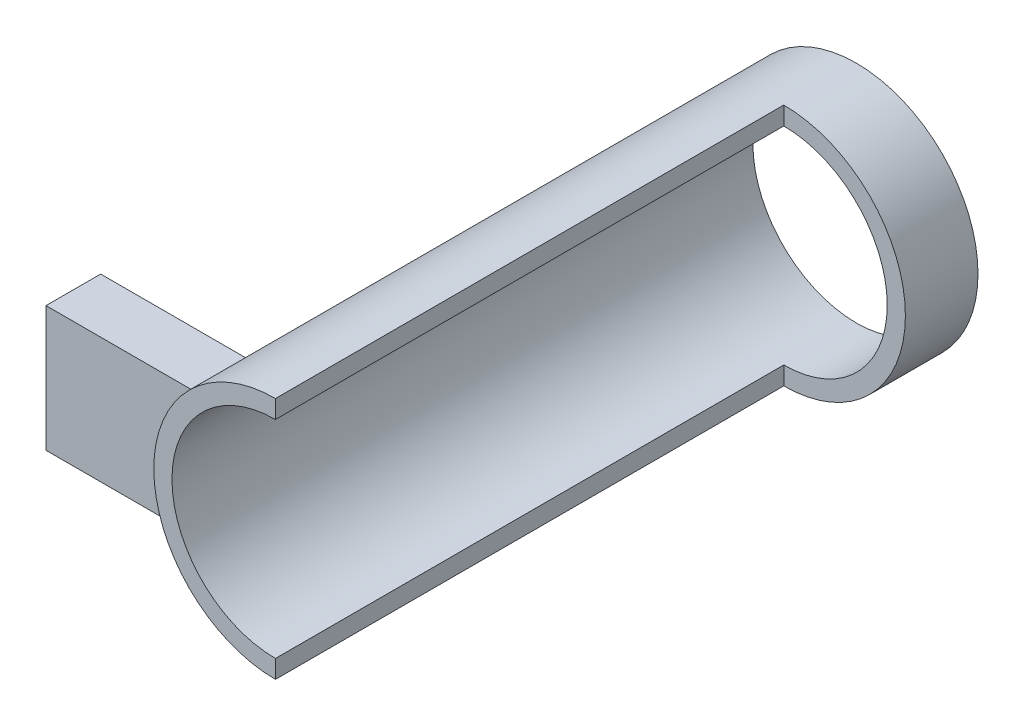
ISO-10303-21;
HEADER;
FILE_DESCRIPTION(('STEP AP214'),'2;1');
FILE_NAME('part.step','',(''),(''),'','','');
FILE_SCHEMA(('AUTOMOTIVE_DESIGN { 1 0 10303 214 1 1 1 1 }'));
ENDSEC;
DATA;
#1=APPLICATION_CONTEXT('core data for automotive mechanical design processes');
#2=APPLICATION_PROTOCOL_DEFINITION('international standard','automotive_design',2000,#1);
#3=PRODUCT_CONTEXT('',#1,'mechanical');
#4=PRODUCT('Part','Part','',(#3));
#5=PRODUCT_RELATED_PRODUCT_CATEGORY('part','',(#4));
#6=PRODUCT_DEFINITION_FORMATION('','',#4);
#7=PRODUCT_DEFINITION_CONTEXT('part definition',#1,'design');
#8=PRODUCT_DEFINITION('design','',#6,#7);
#9=PRODUCT_DEFINITION_SHAPE('','',#8);
#10=(LENGTH_UNIT() NAMED_UNIT(*) SI_UNIT(.MILLI.,.METRE.));
#11=(NAMED_UNIT(*) PLANE_ANGLE_UNIT() SI_UNIT($,.RADIAN.));
#12=(NAMED_UNIT(*) SI_UNIT($,.STERADIAN.) SOLID_ANGLE_UNIT());
#13=UNCERTAINTY_MEASURE_WITH_UNIT(LENGTH_MEASURE(1.E-05),#10,'distance_accuracy_value','');
#14=(GEOMETRIC_REPRESENTATION_CONTEXT(3) GLOBAL_UNCERTAINTY_ASSIGNED_CONTEXT((#13)) GLOBAL_UNIT_ASSIGNED_CONTEXT((#10,
#11,#12)) REPRESENTATION_CONTEXT('',''));
#15=CARTESIAN_POINT('',(0.,0.,0.));
#16=DIRECTION('',(0.,0.,1.));
#17=DIRECTION('',(1.,0.,0.));
#18=AXIS2_PLACEMENT_3D('',#15,#16,#17);
#19=CARTESIAN_POINT('',(0.,0.,2.));
#20=DIRECTION('',(0.,0.,1.));
#21=DIRECTION('',(1.,0.,0.));
#22=AXIS2_PLACEMENT_3D('',#19,#20,#21);
#23=PLANE('',#22);
#24=DIRECTION('',(0.,1.,0.));
#25=VECTOR('',#24,1.);
#26=CARTESIAN_POINT('',(0.,3.35,2.));
#27=LINE('',#26,#25);
#28=CARTESIAN_POINT('',(0.,2.85,2.));
#29=VERTEX_POINT('',#28);
#30=CARTESIAN_POINT('',(0.,3.35,2.));
#31=VERTEX_POINT('',#30);
#32=EDGE_CURVE('E144',#29,#31,#27,.T.);
#33=ORIENTED_EDGE('',*,*,#32,.F.);
#34=CARTESIAN_POINT('',(0.,0.,2.));
#35=DIRECTION('',(0.,0.,1.));
#36=DIRECTION('',(1.,0.,0.));
#37=AXIS2_PLACEMENT_3D('',#34,#35,#36);
#38=CIRCLE('',#37,2.85);
#39=CARTESIAN_POINT('',(0.,-2.85,2.));
#40=VERTEX_POINT('',#39);
#41=EDGE_CURVE('E163',#40,#29,#38,.T.);
#42=ORIENTED_EDGE('',*,*,#41,.F.);
#43=DIRECTION('',(0.,1.,0.));
#44=VECTOR('',#43,1.);
#45=CARTESIAN_POINT('',(0.,-2.85,2.));
#46=LINE('',#45,#44);
#47=CARTESIAN_POINT('',(0.,-3.35,2.));
#48=VERTEX_POINT('',#47);
#49=EDGE_CURVE('E139',#48,#40,#46,.T.);
#50=ORIENTED_EDGE('',*,*,#49,.F.);
#51=CARTESIAN_POINT('',(0.,0.,2.));
#52=DIRECTION('',(0.,0.,1.));
#53=DIRECTION('',(1.,0.,0.));
#54=AXIS2_PLACEMENT_3D('',#51,#52,#53);
#55=CIRCLE('',#54,3.35);
#56=EDGE_CURVE('E11',#48,#31,#55,.T.);
#57=ORIENTED_EDGE('',*,*,#56,.T.);
#58=EDGE_LOOP('',(#33,#42,#50,#57));
#59=FACE_BOUND('',#58,.T.);
#60=ADVANCED_FACE('F33',(#59),#23,.T.);
#61=CARTESIAN_POINT('',(0.,0.,0.));
#62=DIRECTION('',(0.,0.,1.));
#63=DIRECTION('',(1.,0.,0.));
#64=AXIS2_PLACEMENT_3D('',#61,#62,#63);
#65=PLANE('',#64);
#66=CARTESIAN_POINT('',(0.,0.,0.));
#67=DIRECTION('',(0.,0.,1.));
#68=DIRECTION('',(1.,0.,0.));
#69=AXIS2_PLACEMENT_3D('',#66,#67,#68);
#70=CIRCLE('',#69,3.35);
#71=CARTESIAN_POINT('',(3.35,0.,0.));
#72=VERTEX_POINT('',#71);
#73=EDGE_CURVE('E37',#72,#72,#70,.T.);
#74=ORIENTED_EDGE('',*,*,#73,.F.);
#75=EDGE_LOOP('',(#74));
#76=FACE_BOUND('',#75,.T.);
#77=CARTESIAN_POINT('',(0.,0.,0.));
#78=DIRECTION('',(0.,0.,1.));
#79=DIRECTION('',(1.,0.,0.));
#80=AXIS2_PLACEMENT_3D('',#77,#78,#79);
#81=CIRCLE('',#80,2.85);
#82=CARTESIAN_POINT('',(2.85,0.,0.));
#83=VERTEX_POINT('',#82);
#84=EDGE_CURVE('E162',#83,#83,#81,.T.);
#85=ORIENTED_EDGE('',*,*,#84,.T.);
#86=EDGE_LOOP('',(#85));
#87=FACE_BOUND('',#86,.T.);
#88=ADVANCED_FACE('F169',(#76,#87),#65,.F.);
#89=CARTESIAN_POINT('',(0.,0.,2.));
#90=DIRECTION('',(0.,0.,-1.));
#91=DIRECTION('',(-1.,0.,0.));
#92=AXIS2_PLACEMENT_3D('',#89,#90,#91);
#93=CYLINDRICAL_SURFACE('',#92,3.35);
#94=DIRECTION('',(0.,0.,-1.));
#95=VECTOR('',#94,1.);
#96=CARTESIAN_POINT('',(-2.8711163319531,-1.72603331613043,2.));
#97=LINE('',#96,#95);
#98=CARTESIAN_POINT('',(-2.8711163319531,-1.72603331613043,15.3194194759215));
#99=VERTEX_POINT('',#98);
#100=CARTESIAN_POINT('',(-2.8711163319531,-1.72603331613043,13.8140069595972));
#101=VERTEX_POINT('',#100);
#102=EDGE_CURVE('E134',#99,#101,#97,.T.);
#103=ORIENTED_EDGE('',*,*,#102,.T.);
#104=CARTESIAN_POINT('',(0.,0.,13.8140069595972));
#105=DIRECTION('',(0.,0.,-1.));
#106=DIRECTION('',(-1.,0.,0.));
#107=AXIS2_PLACEMENT_3D('',#104,#105,#106);
#108=CIRCLE('',#107,3.35);
#109=CARTESIAN_POINT('',(-2.8711163319531,1.72603331613043,13.8140069595972));
#110=VERTEX_POINT('',#109);
#111=EDGE_CURVE('E137',#101,#110,#108,.T.);
#112=ORIENTED_EDGE('',*,*,#111,.T.);
#113=DIRECTION('',(0.,0.,-1.));
#114=VECTOR('',#113,1.);
#115=CARTESIAN_POINT('',(-2.8711163319531,1.72603331613043,2.));
#116=LINE('',#115,#114);
#117=CARTESIAN_POINT('',(-2.8711163319531,1.72603331613043,15.3194194759215));
#118=VERTEX_POINT('',#117);
#119=EDGE_CURVE('E102',#110,#118,#116,.F.);
#120=ORIENTED_EDGE('',*,*,#119,.T.);
#121=CARTESIAN_POINT('',(0.,0.,15.3194194759215));
#122=DIRECTION('',(0.,0.,1.));
#123=DIRECTION('',(1.,0.,0.));
#124=AXIS2_PLACEMENT_3D('',#121,#122,#123);
#125=CIRCLE('',#124,3.35);
#126=EDGE_CURVE('E131',#118,#99,#125,.T.);
#127=ORIENTED_EDGE('',*,*,#126,.T.);
#128=EDGE_LOOP('',(#103,#112,#120,#127));
#129=FACE_BOUND('',#128,.T.);
#130=ORIENTED_EDGE('',*,*,#56,.F.);
#131=DIRECTION('',(0.,0.,-1.));
#132=VECTOR('',#131,1.);
#133=CARTESIAN_POINT('',(0.,-3.35,16.));
#134=LINE('',#133,#132);
#135=CARTESIAN_POINT('',(0.,-3.35,16.));
#136=VERTEX_POINT('',#135);
#137=EDGE_CURVE('E159',#136,#48,#134,.T.);
#138=ORIENTED_EDGE('',*,*,#137,.F.);
#139=CARTESIAN_POINT('',(0.,0.,16.));
#140=DIRECTION('',(0.,0.,1.));
#141=DIRECTION('',(1.,0.,0.));
#142=AXIS2_PLACEMENT_3D('',#139,#140,#141);
#143=CIRCLE('',#142,3.35);
#144=CARTESIAN_POINT('',(0.,3.35,16.));
#145=VERTEX_POINT('',#144);
#146=EDGE_CURVE('E140',#145,#136,#143,.T.);
#147=ORIENTED_EDGE('',*,*,#146,.F.);
#148=DIRECTION('',(0.,0.,-1.));
#149=VECTOR('',#148,1.);
#150=CARTESIAN_POINT('',(0.,3.35,16.));
#151=LINE('',#150,#149);
#152=EDGE_CURVE('E150',#145,#31,#151,.T.);
#153=ORIENTED_EDGE('',*,*,#152,.T.);
#154=EDGE_LOOP('',(#130,#138,#147,#153));
#155=FACE_BOUND('',#154,.T.);
#156=ORIENTED_EDGE('',*,*,#73,.T.);
#157=EDGE_LOOP('',(#156));
#158=FACE_BOUND('',#157,.T.);
#159=ADVANCED_FACE('F35',(#129,#155,#158),#93,.T.);
#160=CARTESIAN_POINT('',(0.,0.,2.));
#161=DIRECTION('',(0.,0.,-1.));
#162=DIRECTION('',(-1.,0.,0.));
#163=AXIS2_PLACEMENT_3D('',#160,#161,#162);
#164=CYLINDRICAL_SURFACE('',#163,2.85);
#165=DIRECTION('',(0.,0.,-1.));
#166=VECTOR('',#165,1.);
#167=CARTESIAN_POINT('',(0.,-2.85,16.));
#168=LINE('',#167,#166);
#169=CARTESIAN_POINT('',(0.,-2.85,16.));
#170=VERTEX_POINT('',#169);
#171=EDGE_CURVE('E157',#170,#40,#168,.T.);
#172=ORIENTED_EDGE('',*,*,#171,.T.);
#173=ORIENTED_EDGE('',*,*,#41,.T.);
#174=DIRECTION('',(0.,0.,-1.));
#175=VECTOR('',#174,1.);
#176=CARTESIAN_POINT('',(0.,2.85,16.));
#177=LINE('',#176,#175);
#178=CARTESIAN_POINT('',(0.,2.85,16.));
#179=VERTEX_POINT('',#178);
#180=EDGE_CURVE('E56',#179,#29,#177,.T.);
#181=ORIENTED_EDGE('',*,*,#180,.F.);
#182=CARTESIAN_POINT('',(0.,0.,16.));
#183=DIRECTION('',(0.,0.,-1.));
#184=DIRECTION('',(1.,0.,0.));
#185=AXIS2_PLACEMENT_3D('',#182,#183,#184);
#186=CIRCLE('',#185,2.85);
#187=EDGE_CURVE('E146',#170,#179,#186,.T.);
#188=ORIENTED_EDGE('',*,*,#187,.F.);
#189=EDGE_LOOP('',(#172,#173,#181,#188));
#190=FACE_BOUND('',#189,.T.);
#191=ORIENTED_EDGE('',*,*,#84,.F.);
#192=EDGE_LOOP('',(#191));
#193=FACE_BOUND('',#192,.T.);
#194=ADVANCED_FACE('F171',(#190,#193),#164,.F.);
#195=CARTESIAN_POINT('',(0.,-2.85,16.));
#196=DIRECTION('',(-1.,0.,0.));
#197=DIRECTION('',(0.,0.,1.));
#198=AXIS2_PLACEMENT_3D('',#195,#196,#197);
#199=PLANE('',#198);
#200=ORIENTED_EDGE('',*,*,#49,.T.);
#201=ORIENTED_EDGE('',*,*,#171,.F.);
#202=DIRECTION('',(0.,1.,0.));
#203=VECTOR('',#202,1.);
#204=CARTESIAN_POINT('',(0.,-2.85,16.));
#205=LINE('',#204,#203);
#206=EDGE_CURVE('E143',#136,#170,#205,.T.);
#207=ORIENTED_EDGE('',*,*,#206,.F.);
#208=ORIENTED_EDGE('',*,*,#137,.T.);
#209=EDGE_LOOP('',(#200,#201,#207,#208));
#210=FACE_BOUND('',#209,.T.);
#211=ADVANCED_FACE('F173',(#210),#199,.F.);
#212=CARTESIAN_POINT('',(0.,3.35,16.));
#213=DIRECTION('',(-1.,0.,0.));
#214=DIRECTION('',(0.,0.,1.));
#215=AXIS2_PLACEMENT_3D('',#212,#213,#214);
#216=PLANE('',#215);
#217=ORIENTED_EDGE('',*,*,#32,.T.);
#218=ORIENTED_EDGE('',*,*,#152,.F.);
#219=DIRECTION('',(0.,1.,0.));
#220=VECTOR('',#219,1.);
#221=CARTESIAN_POINT('',(0.,3.35,16.));
#222=LINE('',#221,#220);
#223=EDGE_CURVE('E148',#179,#145,#222,.T.);
#224=ORIENTED_EDGE('',*,*,#223,.F.);
#225=ORIENTED_EDGE('',*,*,#180,.T.);
#226=EDGE_LOOP('',(#217,#218,#224,#225));
#227=FACE_BOUND('',#226,.T.);
#228=ADVANCED_FACE('F180',(#227),#216,.F.);
#229=CARTESIAN_POINT('',(0.,0.,16.));
#230=DIRECTION('',(0.,0.,1.));
#231=DIRECTION('',(1.,0.,0.));
#232=AXIS2_PLACEMENT_3D('',#229,#230,#231);
#233=PLANE('',#232);
#234=ORIENTED_EDGE('',*,*,#146,.T.);
#235=ORIENTED_EDGE('',*,*,#206,.T.);
#236=ORIENTED_EDGE('',*,*,#187,.T.);
#237=ORIENTED_EDGE('',*,*,#223,.T.);
#238=EDGE_LOOP('',(#234,#235,#236,#237));
#239=FACE_BOUND('',#238,.T.);
#240=ADVANCED_FACE('F201',(#239),#233,.T.);
#241=CARTESIAN_POINT('',(-7.,-1.72603331613043,15.3194194759215));
#242=DIRECTION('',(0.,-1.,0.));
#243=DIRECTION('',(0.,0.,-1.));
#244=AXIS2_PLACEMENT_3D('',#241,#242,#243);
#245=PLANE('',#244);
#246=ORIENTED_EDGE('',*,*,#102,.F.);
#247=DIRECTION('',(1.,0.,0.));
#248=VECTOR('',#247,1.);
#249=CARTESIAN_POINT('',(-7.,-1.72603331613043,15.3194194759215));
#250=LINE('',#249,#248);
#251=CARTESIAN_POINT('',(-7.,-1.72603331613043,15.3194194759215));
#252=VERTEX_POINT('',#251);
#253=EDGE_CURVE('E126',#252,#99,#250,.T.);
#254=ORIENTED_EDGE('',*,*,#253,.F.);
#255=DIRECTION('',(0.,0.,-1.));
#256=VECTOR('',#255,1.);
#257=CARTESIAN_POINT('',(-7.,-1.72603331613043,15.3194194759215));
#258=LINE('',#257,#256);
#259=CARTESIAN_POINT('',(-7.,-1.72603331613043,13.8140069595972));
#260=VERTEX_POINT('',#259);
#261=EDGE_CURVE('E106',#252,#260,#258,.T.);
#262=ORIENTED_EDGE('',*,*,#261,.T.);
#263=DIRECTION('',(1.,0.,0.));
#264=VECTOR('',#263,1.);
#265=CARTESIAN_POINT('',(-7.,-1.72603331613043,13.8140069595972));
#266=LINE('',#265,#264);
#267=EDGE_CURVE('E120',#260,#101,#266,.T.);
#268=ORIENTED_EDGE('',*,*,#267,.T.);
#269=EDGE_LOOP('',(#246,#254,#262,#268));
#270=FACE_BOUND('',#269,.T.);
#271=ADVANCED_FACE('F203',(#270),#245,.T.);
#272=CARTESIAN_POINT('',(-7.,1.72603331613043,15.3194194759215));
#273=DIRECTION('',(0.,1.,0.));
#274=DIRECTION('',(0.,0.,1.));
#275=AXIS2_PLACEMENT_3D('',#272,#273,#274);
#276=PLANE('',#275);
#277=ORIENTED_EDGE('',*,*,#119,.F.);
#278=DIRECTION('',(1.,0.,0.));
#279=VECTOR('',#278,1.);
#280=CARTESIAN_POINT('',(-7.,1.72603331613043,13.8140069595972));
#281=LINE('',#280,#279);
#282=CARTESIAN_POINT('',(-7.,1.72603331613043,13.8140069595972));
#283=VERTEX_POINT('',#282);
#284=EDGE_CURVE('E97',#283,#110,#281,.T.);
#285=ORIENTED_EDGE('',*,*,#284,.F.);
#286=DIRECTION('',(0.,0.,1.));
#287=VECTOR('',#286,1.);
#288=CARTESIAN_POINT('',(-7.,1.72603331613043,15.3194194759215));
#289=LINE('',#288,#287);
#290=CARTESIAN_POINT('',(-7.,1.72603331613043,15.3194194759215));
#291=VERTEX_POINT('',#290);
#292=EDGE_CURVE('E100',#283,#291,#289,.T.);
#293=ORIENTED_EDGE('',*,*,#292,.T.);
#294=DIRECTION('',(1.,0.,0.));
#295=VECTOR('',#294,1.);
#296=CARTESIAN_POINT('',(-7.,1.72603331613043,15.3194194759215));
#297=LINE('',#296,#295);
#298=EDGE_CURVE('E48',#291,#118,#297,.T.);
#299=ORIENTED_EDGE('',*,*,#298,.T.);
#300=EDGE_LOOP('',(#277,#285,#293,#299));
#301=FACE_BOUND('',#300,.T.);
#302=ADVANCED_FACE('F99',(#301),#276,.T.);
#303=CARTESIAN_POINT('',(-7.,1.72603331613043,13.8140069595972));
#304=DIRECTION('',(0.,0.,-1.));
#305=DIRECTION('',(-1.,0.,0.));
#306=AXIS2_PLACEMENT_3D('',#303,#304,#305);
#307=PLANE('',#306);
#308=ORIENTED_EDGE('',*,*,#111,.F.);
#309=ORIENTED_EDGE('',*,*,#267,.F.);
#310=DIRECTION('',(0.,1.,0.));
#311=VECTOR('',#310,1.);
#312=CARTESIAN_POINT('',(-7.,1.72603331613043,13.8140069595972));
#313=LINE('',#312,#311);
#314=EDGE_CURVE('E113',#260,#283,#313,.T.);
#315=ORIENTED_EDGE('',*,*,#314,.T.);
#316=ORIENTED_EDGE('',*,*,#284,.T.);
#317=EDGE_LOOP('',(#308,#309,#315,#316));
#318=FACE_BOUND('',#317,.T.);
#319=ADVANCED_FACE('F118',(#318),#307,.T.);
#320=CARTESIAN_POINT('',(-7.,1.72603331613043,15.3194194759215));
#321=DIRECTION('',(0.,0.,1.));
#322=DIRECTION('',(1.,0.,0.));
#323=AXIS2_PLACEMENT_3D('',#320,#321,#322);
#324=PLANE('',#323);
#325=ORIENTED_EDGE('',*,*,#126,.F.);
#326=ORIENTED_EDGE('',*,*,#298,.F.);
#327=DIRECTION('',(0.,-1.,0.));
#328=VECTOR('',#327,1.);
#329=CARTESIAN_POINT('',(-7.,1.72603331613043,15.3194194759215));
#330=LINE('',#329,#328);
#331=EDGE_CURVE('E116',#291,#252,#330,.T.);
#332=ORIENTED_EDGE('',*,*,#331,.T.);
#333=ORIENTED_EDGE('',*,*,#253,.T.);
#334=EDGE_LOOP('',(#325,#326,#332,#333));
#335=FACE_BOUND('',#334,.T.);
#336=ADVANCED_FACE('F215',(#335),#324,.T.);
#337=CARTESIAN_POINT('',(-7.,0.,0.));
#338=DIRECTION('',(1.,0.,0.));
#339=DIRECTION('',(0.,0.,-1.));
#340=AXIS2_PLACEMENT_3D('',#337,#338,#339);
#341=PLANE('',#340);
#342=ORIENTED_EDGE('',*,*,#314,.F.);
#343=ORIENTED_EDGE('',*,*,#261,.F.);
#344=ORIENTED_EDGE('',*,*,#331,.F.);
#345=ORIENTED_EDGE('',*,*,#292,.F.);
#346=EDGE_LOOP('',(#342,#343,#344,#345));
#347=FACE_BOUND('',#346,.T.);
#348=ADVANCED_FACE('F111',(#347),#341,.F.);
#349=CLOSED_SHELL('',(#60,#88,#159,#194,#211,#228,#240,#271,#302,#319,#336,#348));
#350=MANIFOLD_SOLID_BREP('B2',#349);
#351=ADVANCED_BREP_SHAPE_REPRESENTATION('',(#18,#350),#14);
#352=SHAPE_DEFINITION_REPRESENTATION(#9,#351);
ENDSEC;
END-ISO-10303-21;
